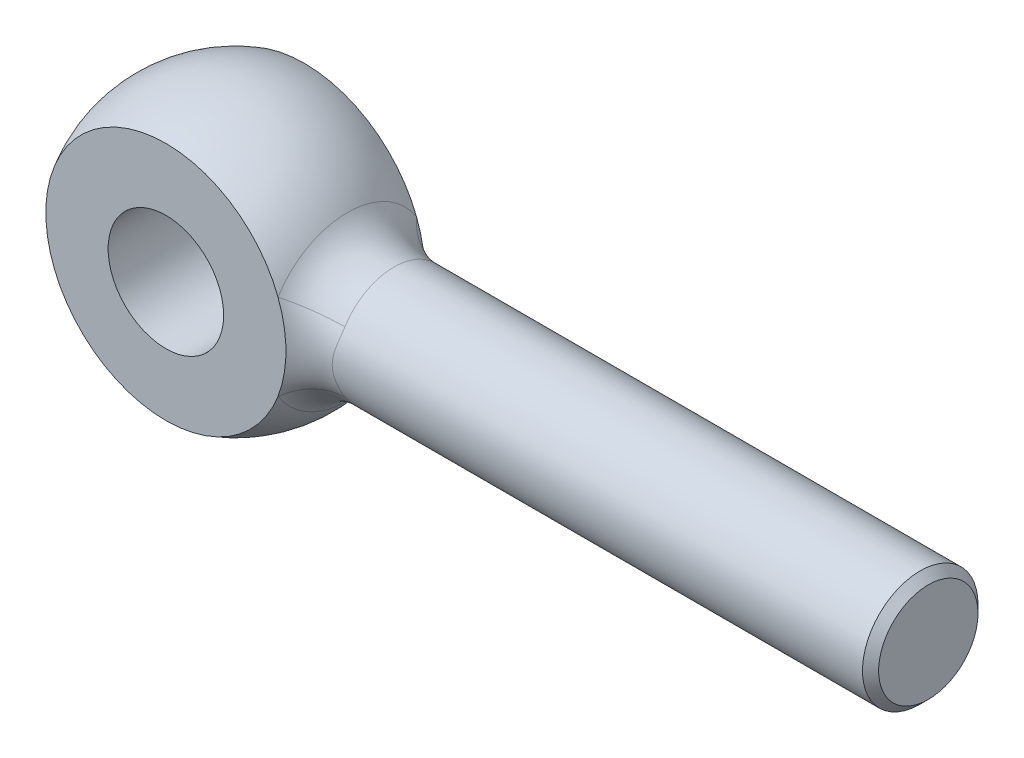
ISO-10303-21;
HEADER;
FILE_DESCRIPTION(('STEP AP214'),'2;1');
FILE_NAME('part.step','',(''),(''),'','','');
FILE_SCHEMA(('AUTOMOTIVE_DESIGN { 1 0 10303 214 1 1 1 1 }'));
ENDSEC;
DATA;
#1=APPLICATION_CONTEXT('core data for automotive mechanical design processes');
#2=APPLICATION_PROTOCOL_DEFINITION('international standard','automotive_design',2000,#1);
#3=PRODUCT_CONTEXT('',#1,'mechanical');
#4=PRODUCT('Part','Part','',(#3));
#5=PRODUCT_RELATED_PRODUCT_CATEGORY('part','',(#4));
#6=PRODUCT_DEFINITION_FORMATION('','',#4);
#7=PRODUCT_DEFINITION_CONTEXT('part definition',#1,'design');
#8=PRODUCT_DEFINITION('design','',#6,#7);
#9=PRODUCT_DEFINITION_SHAPE('','',#8);
#10=(LENGTH_UNIT() NAMED_UNIT(*) SI_UNIT(.MILLI.,.METRE.));
#11=(NAMED_UNIT(*) PLANE_ANGLE_UNIT() SI_UNIT($,.RADIAN.));
#12=(NAMED_UNIT(*) SI_UNIT($,.STERADIAN.) SOLID_ANGLE_UNIT());
#13=UNCERTAINTY_MEASURE_WITH_UNIT(LENGTH_MEASURE(1.E-05),#10,'distance_accuracy_value','');
#14=(GEOMETRIC_REPRESENTATION_CONTEXT(3) GLOBAL_UNCERTAINTY_ASSIGNED_CONTEXT((#13)) GLOBAL_UNIT_ASSIGNED_CONTEXT((#10,
#11,#12)) REPRESENTATION_CONTEXT('',''));
#15=CARTESIAN_POINT('',(0.,0.,0.));
#16=DIRECTION('',(0.,0.,1.));
#17=DIRECTION('',(1.,0.,0.));
#18=AXIS2_PLACEMENT_3D('',#15,#16,#17);
#19=CARTESIAN_POINT('',(0.,0.,0.));
#20=DIRECTION('',(0.,0.,-1.));
#21=DIRECTION('',(0.,1.,0.));
#22=AXIS2_PLACEMENT_3D('',#19,#20,#21);
#23=SPHERICAL_SURFACE('',#22,6.);
#24=CARTESIAN_POINT('',(0.,0.,3.));
#25=DIRECTION('',(0.,0.,-1.));
#26=DIRECTION('',(0.,1.,0.));
#27=AXIS2_PLACEMENT_3D('',#24,#25,#26);
#28=CIRCLE('',#27,5.19615242270663);
#29=CARTESIAN_POINT('',(4.85213897112971,-1.85923301520931,3.));
#30=VERTEX_POINT('',#29);
#31=CARTESIAN_POINT('',(4.85213897112971,1.85923301520931,3.));
#32=VERTEX_POINT('',#31);
#33=EDGE_CURVE('E99',#30,#32,#28,.T.);
#34=ORIENTED_EDGE('',*,*,#33,.T.);
#35=CARTESIAN_POINT('',(4.85213897112971,0.,0.));
#36=DIRECTION('',(-1.,0.,0.));
#37=DIRECTION('',(0.,0.,1.));
#38=AXIS2_PLACEMENT_3D('',#35,#36,#37);
#39=CIRCLE('',#38,3.52941176470588);
#40=CARTESIAN_POINT('',(4.85213897112971,1.85923301520931,-3.));
#41=VERTEX_POINT('',#40);
#42=EDGE_CURVE('E52',#32,#41,#39,.T.);
#43=ORIENTED_EDGE('',*,*,#42,.T.);
#44=CARTESIAN_POINT('',(0.,0.,-3.));
#45=DIRECTION('',(0.,0.,-1.));
#46=DIRECTION('',(0.,1.,0.));
#47=AXIS2_PLACEMENT_3D('',#44,#45,#46);
#48=CIRCLE('',#47,5.19615242270663);
#49=CARTESIAN_POINT('',(4.85213897112971,-1.85923301520931,-3.));
#50=VERTEX_POINT('',#49);
#51=EDGE_CURVE('E47',#50,#41,#48,.T.);
#52=ORIENTED_EDGE('',*,*,#51,.F.);
#53=CARTESIAN_POINT('',(4.85213897112971,0.,0.));
#54=DIRECTION('',(-1.,0.,0.));
#55=DIRECTION('',(0.,0.,1.));
#56=AXIS2_PLACEMENT_3D('',#53,#54,#55);
#57=CIRCLE('',#56,3.52941176470588);
#58=EDGE_CURVE('E193',#50,#30,#57,.T.);
#59=ORIENTED_EDGE('',*,*,#58,.T.);
#60=EDGE_LOOP('',(#34,#43,#52,#59));
#61=FACE_BOUND('',#60,.T.);
#62=ADVANCED_FACE('F31',(#61),#23,.T.);
#63=CARTESIAN_POINT('',(0.,5.19615242270663,3.));
#64=DIRECTION('',(0.,0.,1.));
#65=DIRECTION('',(0.,-1.,0.));
#66=AXIS2_PLACEMENT_3D('',#63,#64,#65);
#67=PLANE('',#66);
#68=CARTESIAN_POINT('',(0.,0.,3.));
#69=DIRECTION('',(0.,0.,1.));
#70=DIRECTION('',(1.,0.,0.));
#71=AXIS2_PLACEMENT_3D('',#68,#69,#70);
#72=CIRCLE('',#71,2.5);
#73=CARTESIAN_POINT('',(2.5,0.,3.));
#74=VERTEX_POINT('',#73);
#75=EDGE_CURVE('E90',#74,#74,#72,.T.);
#76=ORIENTED_EDGE('',*,*,#75,.F.);
#77=EDGE_LOOP('',(#76));
#78=FACE_BOUND('',#77,.T.);
#79=EDGE_CURVE('E96',#32,#30,#28,.T.);
#80=ORIENTED_EDGE('',*,*,#79,.F.);
#81=ORIENTED_EDGE('',*,*,#33,.F.);
#82=EDGE_LOOP('',(#80,#81));
#83=FACE_BOUND('',#82,.T.);
#84=ADVANCED_FACE('F152',(#78,#83),#67,.T.);
#85=CARTESIAN_POINT('',(0.,0.,-3.));
#86=DIRECTION('',(0.,0.,-1.));
#87=DIRECTION('',(0.,1.,0.));
#88=AXIS2_PLACEMENT_3D('',#85,#86,#87);
#89=PLANE('',#88);
#90=CARTESIAN_POINT('',(0.,0.,-3.));
#91=DIRECTION('',(0.,0.,1.));
#92=DIRECTION('',(1.,0.,0.));
#93=AXIS2_PLACEMENT_3D('',#90,#91,#92);
#94=CIRCLE('',#93,2.5);
#95=CARTESIAN_POINT('',(2.5,0.,-3.));
#96=VERTEX_POINT('',#95);
#97=EDGE_CURVE('E147',#96,#96,#94,.T.);
#98=ORIENTED_EDGE('',*,*,#97,.T.);
#99=EDGE_LOOP('',(#98));
#100=FACE_BOUND('',#99,.T.);
#101=EDGE_CURVE('E88',#41,#50,#48,.T.);
#102=ORIENTED_EDGE('',*,*,#101,.T.);
#103=ORIENTED_EDGE('',*,*,#51,.T.);
#104=EDGE_LOOP('',(#102,#103));
#105=FACE_BOUND('',#104,.T.);
#106=ADVANCED_FACE('F150',(#100,#105),#89,.T.);
#107=CARTESIAN_POINT('',(0.,0.,-3.));
#108=DIRECTION('',(0.,0.,1.));
#109=DIRECTION('',(1.,0.,0.));
#110=AXIS2_PLACEMENT_3D('',#107,#108,#109);
#111=CYLINDRICAL_SURFACE('',#110,2.5);
#112=CARTESIAN_POINT('',(2.5,0.,-3.));
#113=CARTESIAN_POINT('',(2.5,0.,-2.9375));
#114=CARTESIAN_POINT('',(2.5,0.,-2.875));
#115=CARTESIAN_POINT('',(2.5,0.,-2.75));
#116=CARTESIAN_POINT('',(2.5,0.,-2.6875));
#117=CARTESIAN_POINT('',(2.5,0.,-2.5625));
#118=CARTESIAN_POINT('',(2.5,0.,-2.5));
#119=CARTESIAN_POINT('',(2.5,0.,-2.375));
#120=CARTESIAN_POINT('',(2.5,0.,-2.3125));
#121=CARTESIAN_POINT('',(2.5,0.,-2.1875));
#122=CARTESIAN_POINT('',(2.5,0.,-2.125));
#123=CARTESIAN_POINT('',(2.5,0.,-2.));
#124=CARTESIAN_POINT('',(2.5,0.,-1.9375));
#125=CARTESIAN_POINT('',(2.5,0.,-1.8125));
#126=CARTESIAN_POINT('',(2.5,0.,-1.75));
#127=CARTESIAN_POINT('',(2.5,0.,-1.625));
#128=CARTESIAN_POINT('',(2.5,0.,-1.5625));
#129=CARTESIAN_POINT('',(2.5,0.,-1.4375));
#130=CARTESIAN_POINT('',(2.5,0.,-1.375));
#131=CARTESIAN_POINT('',(2.5,0.,-1.25));
#132=CARTESIAN_POINT('',(2.5,0.,-1.1875));
#133=CARTESIAN_POINT('',(2.5,0.,-1.0625));
#134=CARTESIAN_POINT('',(2.5,0.,-1.));
#135=CARTESIAN_POINT('',(2.5,0.,-0.875000000000003));
#136=CARTESIAN_POINT('',(2.5,0.,-0.812500000000003));
#137=CARTESIAN_POINT('',(2.5,0.,-0.687500000000003));
#138=CARTESIAN_POINT('',(2.5,0.,-0.625000000000003));
#139=CARTESIAN_POINT('',(2.5,0.,-0.500000000000003));
#140=CARTESIAN_POINT('',(2.5,0.,-0.437500000000003));
#141=CARTESIAN_POINT('',(2.5,0.,-0.312500000000003));
#142=CARTESIAN_POINT('',(2.5,0.,-0.250000000000003));
#143=CARTESIAN_POINT('',(2.5,0.,-0.125000000000003));
#144=CARTESIAN_POINT('',(2.5,0.,-0.0625000000000027));
#145=CARTESIAN_POINT('',(2.5,0.,0.0624999999999975));
#146=CARTESIAN_POINT('',(2.5,0.,0.124999999999998));
#147=CARTESIAN_POINT('',(2.5,0.,0.249999999999998));
#148=CARTESIAN_POINT('',(2.5,0.,0.312499999999998));
#149=CARTESIAN_POINT('',(2.5,0.,0.437499999999998));
#150=CARTESIAN_POINT('',(2.5,0.,0.499999999999998));
#151=CARTESIAN_POINT('',(2.5,0.,0.624999999999998));
#152=CARTESIAN_POINT('',(2.5,0.,0.687499999999998));
#153=CARTESIAN_POINT('',(2.5,0.,0.812499999999998));
#154=CARTESIAN_POINT('',(2.5,0.,0.874999999999997));
#155=CARTESIAN_POINT('',(2.5,0.,0.999999999999997));
#156=CARTESIAN_POINT('',(2.5,0.,1.0625));
#157=CARTESIAN_POINT('',(2.5,0.,1.1875));
#158=CARTESIAN_POINT('',(2.5,0.,1.25));
#159=CARTESIAN_POINT('',(2.5,0.,1.375));
#160=CARTESIAN_POINT('',(2.5,0.,1.4375));
#161=CARTESIAN_POINT('',(2.5,0.,1.5625));
#162=CARTESIAN_POINT('',(2.5,0.,1.625));
#163=CARTESIAN_POINT('',(2.5,0.,1.75));
#164=CARTESIAN_POINT('',(2.5,0.,1.8125));
#165=CARTESIAN_POINT('',(2.5,0.,1.9375));
#166=CARTESIAN_POINT('',(2.5,0.,2.));
#167=CARTESIAN_POINT('',(2.5,0.,2.125));
#168=CARTESIAN_POINT('',(2.5,0.,2.1875));
#169=CARTESIAN_POINT('',(2.5,0.,2.3125));
#170=CARTESIAN_POINT('',(2.5,0.,2.375));
#171=CARTESIAN_POINT('',(2.5,0.,2.5));
#172=CARTESIAN_POINT('',(2.5,0.,2.5625));
#173=CARTESIAN_POINT('',(2.5,0.,2.6875));
#174=CARTESIAN_POINT('',(2.5,0.,2.75));
#175=CARTESIAN_POINT('',(2.5,0.,2.875));
#176=CARTESIAN_POINT('',(2.5,0.,2.9375));
#177=CARTESIAN_POINT('',(2.5,0.,3.));
#178=B_SPLINE_CURVE_WITH_KNOTS('',3,(#112,#113,#114,#115,#116,#117,#118,#119,#120,#121,#122,
#123,#124,#125,#126,#127,#128,#129,#130,#131,#132,#133,#134,#135,#136,#137,#138,#139,#140,#141,
#142,#143,#144,#145,#146,#147,#148,#149,#150,#151,#152,#153,#154,#155,#156,#157,#158,#159,#160,
#161,#162,#163,#164,#165,#166,#167,#168,#169,#170,#171,#172,#173,#174,#175,#176,#177),
.UNSPECIFIED.,.F.,.F.,(4,2,2,2,2,2,2,2,2,2,2,2,2,2,2,2,2,2,2,2,2,2,2,2,2,2,2,2,2,2,2,2,4),(0.,
0.1875,0.375,0.5625,0.75,0.9375,1.125,1.3125,1.5,1.6875,1.875,2.0625,2.25,2.4375,2.625,2.8125,
3.,3.1875,3.375,3.5625,3.75,3.9375,4.125,4.3125,4.5,4.6875,4.875,5.0625,5.25,5.4375,5.625,
5.8125,6.),.UNSPECIFIED.);
#179=EDGE_CURVE('BSEAM116',#96,#74,#178,.T.);
#180=ORIENTED_EDGE('',*,*,#97,.F.);
#181=ORIENTED_EDGE('',*,*,#75,.T.);
#182=ORIENTED_EDGE('',*,*,#179,.T.);
#183=ORIENTED_EDGE('',*,*,#179,.F.);
#184=EDGE_LOOP('',(#180,#182,#181,#183));
#185=FACE_BOUND('',#184,.T.);
#186=ADVANCED_FACE('F116',(#185),#111,.F.);
#187=CARTESIAN_POINT('',(-500000.,0.,0.));
#188=DIRECTION('',(1.,0.,0.));
#189=DIRECTION('',(0.,0.,-1.));
#190=AXIS2_PLACEMENT_3D('',#187,#188,#189);
#191=CYLINDRICAL_SURFACE('',#190,2.5);
#192=CARTESIAN_POINT('',(29.6500000000037,0.,0.));
#193=DIRECTION('',(1.,0.,0.));
#194=DIRECTION('',(0.,0.,-1.));
#195=AXIS2_PLACEMENT_3D('',#192,#193,#194);
#196=CIRCLE('',#195,2.5);
#197=CARTESIAN_POINT('',(29.6500000000037,0.,-2.5));
#198=VERTEX_POINT('',#197);
#199=EDGE_CURVE('E11',#198,#198,#196,.F.);
#200=ORIENTED_EDGE('',*,*,#199,.T.);
#201=EDGE_LOOP('',(#200));
#202=FACE_BOUND('',#201,.T.);
#203=CARTESIAN_POINT('',(6.87386354240971,0.,0.));
#204=DIRECTION('',(-1.,0.,0.));
#205=DIRECTION('',(0.,0.,1.));
#206=AXIS2_PLACEMENT_3D('',#203,#204,#205);
#207=CIRCLE('',#206,2.5);
#208=CARTESIAN_POINT('',(6.87386354240971,1.31695671910659,-2.125));
#209=VERTEX_POINT('',#208);
#210=CARTESIAN_POINT('',(6.87386354240971,1.31695671910659,2.125));
#211=VERTEX_POINT('',#210);
#212=EDGE_CURVE('E76',#209,#211,#207,.F.);
#213=ORIENTED_EDGE('',*,*,#212,.T.);
#214=CARTESIAN_POINT('',(4.59214994265628,-2.43149314293953,3.));
#215=CARTESIAN_POINT('',(5.28053575775771,-1.57535220086278,1.96520839767909));
#216=CARTESIAN_POINT('',(6.75832715044316,-1.78923016469218,1.74603992444491));
#217=CARTESIAN_POINT('',(4.61490376458602,-2.38850683564425,3.));
#218=CARTESIAN_POINT('',(5.31133447792518,-1.55959961205067,1.97255373721356));
#219=CARTESIAN_POINT('',(6.77910060073798,-1.75423109346333,1.78191190260491));
#220=CARTESIAN_POINT('',(4.63745636511603,-2.3444677912677,3.));
#221=CARTESIAN_POINT('',(5.34142415476619,-1.54285102882922,1.98165998300467));
#222=CARTESIAN_POINT('',(6.79676173803568,-1.71794485728992,1.81692874609134));
#223=CARTESIAN_POINT('',(4.68208984782817,-2.25401656337519,3.));
#224=CARTESIAN_POINT('',(5.39964168622278,-1.50660421494995,2.00308043484603));
#225=CARTESIAN_POINT('',(6.82631837247987,-1.64302998661491,1.88494214654378));
#226=CARTESIAN_POINT('',(4.70417113781937,-2.20760656006237,3.));
#227=CARTESIAN_POINT('',(5.4277688669536,-1.4871353529735,2.01536574496717));
#228=CARTESIAN_POINT('',(6.83821906475119,-1.60440349821119,1.91794050035157));
#229=CARTESIAN_POINT('',(4.76925390986343,-2.06520099180171,3.));
#230=CARTESIAN_POINT('',(5.50800845739551,-1.42401012943105,2.05618321132367));
#231=CARTESIAN_POINT('',(6.86584024141128,-1.4860110400398,2.01293813667689));
#232=CARTESIAN_POINT('',(4.81152459527922,-1.96523133744892,3.));
#233=CARTESIAN_POINT('',(5.55713810549072,-1.37513487706764,2.08895338732615));
#234=CARTESIAN_POINT('',(6.87385227471106,-1.40306501907976,2.07162568455478));
#235=CARTESIAN_POINT('',(4.8783946126459,-1.79070915163239,3.));
#236=CARTESIAN_POINT('',(5.62890675658226,-1.27978016024519,2.14803422907822));
#237=CARTESIAN_POINT('',(6.87387082658577,-1.26129099463547,2.15950445471963));
#238=CARTESIAN_POINT('',(4.90395806114932,-1.71966583041613,3.));
#239=CARTESIAN_POINT('',(5.65470668144478,-1.23880448776534,2.17240659583395));
#240=CARTESIAN_POINT('',(6.87053448817763,-1.20430371320232,2.19178844145302));
#241=CARTESIAN_POINT('',(4.95325032102841,-1.57205756477042,3.));
#242=CARTESIAN_POINT('',(5.70135971194108,-1.14902529564279,2.22187165387093));
#243=CARTESIAN_POINT('',(6.85874012586845,-1.08807830259442,2.25174446555758));
#244=CARTESIAN_POINT('',(4.97697936627991,-1.49549332663971,3.));
#245=CARTESIAN_POINT('',(5.72226372809931,-1.10027824672045,2.24696521577949));
#246=CARTESIAN_POINT('',(6.8502827560878,-1.02884046179405,2.27941709137223));
#247=CARTESIAN_POINT('',(5.02208838637354,-1.33622773621118,3.));
#248=CARTESIAN_POINT('',(5.75919637874928,-0.994766582037669,2.2961562377678));
#249=CARTESIAN_POINT('',(6.82996392358939,-0.908272256559426,2.33009420794455));
#250=CARTESIAN_POINT('',(5.04345843771728,-1.25350273984687,3.));
#251=CARTESIAN_POINT('',(5.77525913675865,-0.937996614504071,2.32027606751086));
#252=CARTESIAN_POINT('',(6.81808878604984,-0.84693437601848,2.35307929929945));
#253=CARTESIAN_POINT('',(5.0829956710211,-1.08207581441005,3.));
#254=CARTESIAN_POINT('',(5.8027192817968,-0.817063699502059,2.36563031726336));
#255=CARTESIAN_POINT('',(6.7930115433918,-0.722706570778251,2.39415434758543));
#256=CARTESIAN_POINT('',(5.10116268053655,-0.993373563890664,3.));
#257=CARTESIAN_POINT('',(5.81416505850588,-0.752888667793522,2.3869099789471));
#258=CARTESIAN_POINT('',(6.77980936688855,-0.659816562723553,2.41224404098724));
#259=CARTESIAN_POINT('',(5.133769783665,-0.808336982222404,3.));
#260=CARTESIAN_POINT('',(5.83317177270153,-0.616670109113473,2.42535367081966));
#261=CARTESIAN_POINT('',(6.75412598731616,-0.531409319746842,2.4437813743836));
#262=CARTESIAN_POINT('',(5.14812236233714,-0.711880425797137,3.));
#263=CARTESIAN_POINT('',(5.84068604935766,-0.544415702972543,2.44248046219873));
#264=CARTESIAN_POINT('',(6.74166609915638,-0.465864656223572,2.45712206448678));
#265=CARTESIAN_POINT('',(5.17161456510394,-0.514100714128217,3.));
#266=CARTESIAN_POINT('',(5.85222557044449,-0.394834809688415,2.47053593334535));
#267=CARTESIAN_POINT('',(6.72032900847461,-0.333775500541907,2.47852132015821));
#268=CARTESIAN_POINT('',(5.18075512882778,-0.412778439656206,3.));
#269=CARTESIAN_POINT('',(5.85627741111682,-0.317388833417816,2.48151904357428));
#270=CARTESIAN_POINT('',(6.71145116026202,-0.267231190822656,2.48658083786253));
#271=CARTESIAN_POINT('',(5.19301777361388,-0.207573020256737,3.));
#272=CARTESIAN_POINT('',(5.86156507424017,-0.159990647980406,2.49622745732));
#273=CARTESIAN_POINT('',(6.69936859130023,-0.133752220883058,2.49731446053791));
#274=CARTESIAN_POINT('',(5.19615608527373,-0.103697552968933,3.));
#275=CARTESIAN_POINT('',(5.86282050140857,-0.0798807066107877,2.5000044561634));
#276=CARTESIAN_POINT('',(6.69614857322438,-0.0668191056656173,2.50000308972525));
#277=CARTESIAN_POINT('',(5.19614875416296,0.104050074106533,3.));
#278=CARTESIAN_POINT('',(5.86281767488507,0.0801523733243785,2.49999553665747));
#279=CARTESIAN_POINT('',(6.69615627823717,0.0670462482282195,2.49999690511617));
#280=CARTESIAN_POINT('',(5.19300322676458,0.207922233919905,3.));
#281=CARTESIAN_POINT('',(5.8615594607505,0.160259169274489,2.49620973684774));
#282=CARTESIAN_POINT('',(6.69938388294647,0.133978486898146,2.49730219015876));
#283=CARTESIAN_POINT('',(5.18099822303184,0.408608492862907,3.));
#284=CARTESIAN_POINT('',(5.85638185970961,0.31418229108765,2.4818115656295));
#285=CARTESIAN_POINT('',(6.71121073415326,0.26451962864652,2.48679318433977));
#286=CARTESIAN_POINT('',(5.1723800332294,0.505536932703433,3.));
#287=CARTESIAN_POINT('',(5.85256350616984,0.388277395405999,2.47145810155465));
#288=CARTESIAN_POINT('',(6.71958268776289,0.328151643768273,2.47919487031465));
#289=CARTESIAN_POINT('',(5.15034663440711,0.695010504169693,3.));
#290=CARTESIAN_POINT('',(5.84181425991675,0.531696848105887,2.44513655691866));
#291=CARTESIAN_POINT('',(6.7396898863661,0.454514395543326,2.45916861075663));
#292=CARTESIAN_POINT('',(5.1369308923803,0.787555147462384,3.));
#293=CARTESIAN_POINT('',(5.83486087213319,0.60112791287206,2.42912177748058));
#294=CARTESIAN_POINT('',(6.7514255050333,0.517245031247764,2.44674012857986));
#295=CARTESIAN_POINT('',(5.10611604160582,0.96743475766652,3.));
#296=CARTESIAN_POINT('',(5.81717454078441,0.73394910021624,2.39272981231407));
#297=CARTESIAN_POINT('',(6.77606712257304,0.641619764359883,2.4171094165628));
#298=CARTESIAN_POINT('',(5.08871022901508,1.05476064150526,3.));
#299=CARTESIAN_POINT('',(5.80640090434268,0.797388927566587,2.37229427704273));
#300=CARTESIAN_POINT('',(6.78897506881877,0.703261842965872,2.39989914224598));
#301=CARTESIAN_POINT('',(5.05074703659571,1.22370514902623,3.));
#302=CARTESIAN_POINT('',(5.78053270257552,0.917245605894557,2.32857079049401));
#303=CARTESIAN_POINT('',(6.81375724791258,0.825092162079843,2.36078715652006));
#304=CARTESIAN_POINT('',(5.03018974389835,1.30532393040607,3.));
#305=CARTESIAN_POINT('',(5.76539366645214,0.973678293362055,2.30523897942312));
#306=CARTESIAN_POINT('',(6.82563150932547,0.885280442728796,2.33888557480828));
#307=CARTESIAN_POINT('',(4.98479784236225,1.4695764279093,3.));
#308=CARTESIAN_POINT('',(5.7289816728793,1.08358216256709,2.25530458502804));
#309=CARTESIAN_POINT('',(6.8472592247355,1.00892487377986,2.28842628515865));
#310=CARTESIAN_POINT('',(4.95974869047,1.55171480623705,3.));
#311=CARTESIAN_POINT('',(5.70725082348089,1.13633445812298,2.22857701334387));
#312=CARTESIAN_POINT('',(6.85674922779622,1.07222830649481,2.25946290619329));
#313=CARTESIAN_POINT('',(4.9075366632047,1.70967749662367,3.));
#314=CARTESIAN_POINT('',(5.65828641889,1.23304453288595,2.175819043809));
#315=CARTESIAN_POINT('',(6.87003809483746,1.19630031720458,2.19629492865154));
#316=CARTESIAN_POINT('',(4.88037464978229,1.7855043576292,3.));
#317=CARTESIAN_POINT('',(5.63099357756278,1.27694101464195,2.14978488345376));
#318=CARTESIAN_POINT('',(6.87383926692379,1.25706991350832,2.16209246192086));
#319=CARTESIAN_POINT('',(4.82434415025922,1.93181099590173,3.));
#320=CARTESIAN_POINT('',(5.57103910119506,1.35673203653411,2.10036423278424));
#321=CARTESIAN_POINT('',(6.87388766513498,1.37590882134256,2.08848667559372));
#322=CARTESIAN_POINT('',(4.79546636364266,2.00225578165343,3.));
#323=CARTESIAN_POINT('',(5.53829925215443,1.39248889737653,2.0770261697273));
#324=CARTESIAN_POINT('',(6.87008921310799,1.43395964519697,2.04905324501219));
#325=CARTESIAN_POINT('',(4.73649100392029,2.13800852417529,3.));
#326=CARTESIAN_POINT('',(5.46815489089738,1.45699822287206,2.03481463104619));
#327=CARTESIAN_POINT('',(6.85326158629086,1.54645124864898,1.96556393134342));
#328=CARTESIAN_POINT('',(4.70639108455953,2.20330581652231,3.));
#329=CARTESIAN_POINT('',(5.4307156037342,1.48565020344881,2.01600551450621));
#330=CARTESIAN_POINT('',(6.8402137799444,1.60088449867127,1.92149887132414));
#331=CARTESIAN_POINT('',(4.67590808800945,2.26624878433234,3.));
#332=CARTESIAN_POINT('',(5.39155050442724,1.51128592173718,2.00044213210106));
#333=CARTESIAN_POINT('',(6.82175156100176,1.65313195759463,1.8754078838427));
#334=(BOUNDED_SURFACE() B_SPLINE_SURFACE(3,2,((#214,#215,#216),(#217,#218,#219),(#220,#221,
#222),(#223,#224,#225),(#226,#227,#228),(#229,#230,#231),(#232,#233,#234),(#235,#236,#237),
(#238,#239,#240),(#241,#242,#243),(#244,#245,#246),(#247,#248,#249),(#250,#251,#252),(#253,#254,
#255),(#256,#257,#258),(#259,#260,#261),(#262,#263,#264),(#265,#266,#267),(#268,#269,#270),
(#271,#272,#273),(#274,#275,#276),(#277,#278,#279),(#280,#281,#282),(#283,#284,#285),(#286,#287,
#288),(#289,#290,#291),(#292,#293,#294),(#295,#296,#297),(#298,#299,#300),(#301,#302,#303),
(#304,#305,#306),(#307,#308,#309),(#310,#311,#312),(#313,#314,#315),(#316,#317,#318),(#319,#320,
#321),(#322,#323,#324),(#325,#326,#327),(#328,#329,#330),(#331,#332,#333)),.UNSPECIFIED.,.F.,
.F.,.F.) B_SPLINE_SURFACE_WITH_KNOTS((4,2,2,2,2,2,2,2,2,2,2,2,2,2,2,2,2,2,2,4),(3,3),(0.,
0.306874845816542,0.613472414905768,1.22088780228112,1.61355863196533,2.00617931553497,
2.4003932871802,2.79462847594899,3.19725118928502,3.59980129428171,4.00126132214201,
4.40271397920349,4.78759099989169,5.17251079361862,5.55808210564121,5.94364275941515,
6.36173259498714,6.77965275467295,7.2000924034159,7.62138138566917),(0.,1.),
.UNSPECIFIED.) GEOMETRIC_REPRESENTATION_ITEM() RATIONAL_B_SPLINE_SURFACE(((1.,0.856101832731396,
1.),(1.,0.858642244405248,1.),(1.,0.861316738759473,1.),(1.,0.866881962600633,1.),(1.,
0.869772494524879,1.),(1.,0.87864161799571,1.),(1.,0.884867476557533,1.),(1.,0.895183073476045,
1.),(1.,0.899249846421728,1.),(1.,0.907247649770585,1.),(1.,0.911178697442465,1.),(1.,
0.918740850713103,1.),(1.,0.922370674384753,1.),(1.,0.929127710867441,1.),(1.,0.932254896616775,
1.),(1.,0.937881051025087,1.),(1.,0.940365238590998,1.),(1.,0.944432807754107,1.),(1.,
0.946016351720428,1.),(1.,0.948140508697703,1.),(1.,0.948683934279783,1.),(1.,0.948682660786239,
1.),(1.,0.94813798168838,1.),(1.,0.946058468186153,1.),(1.,0.944565445011657,1.),(1.,
0.940750261329809,1.),(1.,0.938428008695299,1.),(1.,0.933108402694527,1.),(1.,0.930109913300485,
1.),(1.,0.923612393628672,1.),(1.,0.920113377189517,1.),(1.,0.912478934938097,1.),(1.,
0.908314722372954,1.),(1.,0.899820033646503,1.),(1.,0.895489625646799,1.),(1.,0.886843969906887,
1.),(1.,0.88252897094876,1.),(1.,0.874118019577032,1.),(1.,0.870022527269921,1.),(1.,
0.86613477284922,1.))) REPRESENTATION_ITEM('') SURFACE());
#335=CARTESIAN_POINT('',(6.82175156100176,1.65313195759463,1.8754078838427));
#336=CARTESIAN_POINT('',(6.8402137799444,1.60088449867127,1.92149887132414));
#337=CARTESIAN_POINT('',(6.85326158629086,1.54645124864898,1.96556393134342));
#338=CARTESIAN_POINT('',(6.87008921310799,1.43395964519697,2.04905324501219));
#339=CARTESIAN_POINT('',(6.87388766513498,1.37590882134256,2.08848667559372));
#340=CARTESIAN_POINT('',(6.87383926692379,1.25706991350832,2.16209246192086));
#341=CARTESIAN_POINT('',(6.87003809483746,1.19630031720458,2.19629492865154));
#342=CARTESIAN_POINT('',(6.85674922779622,1.07222830649481,2.25946290619329));
#343=CARTESIAN_POINT('',(6.8472592247355,1.00892487377986,2.28842628515865));
#344=CARTESIAN_POINT('',(6.82563150932547,0.885280442728796,2.33888557480828));
#345=CARTESIAN_POINT('',(6.81375724791258,0.825092162079843,2.36078715652006));
#346=CARTESIAN_POINT('',(6.78897506881877,0.703261842965872,2.39989914224598));
#347=CARTESIAN_POINT('',(6.77606712257304,0.641619764359883,2.4171094165628));
#348=CARTESIAN_POINT('',(6.7514255050333,0.517245031247764,2.44674012857986));
#349=CARTESIAN_POINT('',(6.7396898863661,0.454514395543326,2.45916861075663));
#350=CARTESIAN_POINT('',(6.71958268776289,0.328151643768273,2.47919487031465));
#351=CARTESIAN_POINT('',(6.71121073415326,0.26451962864652,2.48679318433977));
#352=CARTESIAN_POINT('',(6.69938388294647,0.133978486898146,2.49730219015876));
#353=CARTESIAN_POINT('',(6.69615627823717,0.0670462482282195,2.49999690511617));
#354=CARTESIAN_POINT('',(6.69614857322438,-0.0668191056656173,2.50000308972525));
#355=CARTESIAN_POINT('',(6.69936859130023,-0.133752220883058,2.49731446053791));
#356=CARTESIAN_POINT('',(6.71145116026202,-0.267231190822656,2.48658083786253));
#357=CARTESIAN_POINT('',(6.72032900847461,-0.333775500541907,2.47852132015821));
#358=CARTESIAN_POINT('',(6.74166609915638,-0.465864656223572,2.45712206448678));
#359=CARTESIAN_POINT('',(6.75412598731616,-0.531409319746842,2.4437813743836));
#360=CARTESIAN_POINT('',(6.77980936688854,-0.659816562723553,2.41224404098724));
#361=CARTESIAN_POINT('',(6.7930115433918,-0.722706570778251,2.39415434758543));
#362=CARTESIAN_POINT('',(6.81808878604984,-0.84693437601848,2.35307929929945));
#363=CARTESIAN_POINT('',(6.82996392358939,-0.908272256559426,2.33009420794455));
#364=CARTESIAN_POINT('',(6.8502827560878,-1.02884046179405,2.27941709137223));
#365=CARTESIAN_POINT('',(6.85874012586845,-1.08807830259442,2.25174446555758));
#366=CARTESIAN_POINT('',(6.87053448817763,-1.20430371320232,2.19178844145302));
#367=CARTESIAN_POINT('',(6.87387082658577,-1.26129099463547,2.15950445471963));
#368=CARTESIAN_POINT('',(6.87385227471106,-1.40306501907976,2.07162568455478));
#369=CARTESIAN_POINT('',(6.86584024141128,-1.4860110400398,2.01293813667689));
#370=CARTESIAN_POINT('',(6.83821906475119,-1.60440349821119,1.91794050035157));
#371=CARTESIAN_POINT('',(6.82631837247987,-1.64302998661491,1.88494214654378));
#372=CARTESIAN_POINT('',(6.79676173803568,-1.71794485728992,1.81692874609134));
#373=CARTESIAN_POINT('',(6.77910060073798,-1.75423109346333,1.78191190260491));
#374=CARTESIAN_POINT('',(6.75832715044316,-1.78923016469218,1.74603992444491));
#375=B_SPLINE_CURVE_WITH_KNOTS('',3,(#335,#336,#337,#338,#339,#340,#341,#342,#343,#344,#345,
#346,#347,#348,#349,#350,#351,#352,#353,#354,#355,#356,#357,#358,#359,#360,#361,#362,#363,#364,
#365,#366,#367,#368,#369,#370,#371,#372,#373,#374),.UNSPECIFIED.,.F.,.F.,(4,2,2,2,2,2,2,2,2,2,2,
2,2,2,2,2,2,2,2,4),(0.,0.421288982253265,0.841728630996219,1.25964879068203,1.67773862625402,
2.06329928002796,2.44887059205055,2.83379038577747,3.21866740646568,3.62012006352716,
4.02158009138746,4.42413019638415,4.82675290972018,5.22098809848897,5.6152020701342,
6.00782275370384,6.40049358338804,7.0079089707634,7.31450653985263,7.62138138566917),.UNSPECIFIED.);
#376=CARTESIAN_POINT('',(6.87386354240971,-1.31695671910659,2.125));
#377=VERTEX_POINT('',#376);
#378=EDGE_CURVE('E195',#211,#377,#375,.T.);
#379=ORIENTED_EDGE('',*,*,#378,.T.);
#380=CARTESIAN_POINT('',(6.87386354240971,0.,0.));
#381=DIRECTION('',(-1.,0.,0.));
#382=DIRECTION('',(0.,0.,1.));
#383=AXIS2_PLACEMENT_3D('',#380,#381,#382);
#384=CIRCLE('',#383,2.5);
#385=CARTESIAN_POINT('',(6.87386354240971,-1.31695671910659,-2.125));
#386=VERTEX_POINT('',#385);
#387=EDGE_CURVE('E79',#377,#386,#384,.F.);
#388=ORIENTED_EDGE('',*,*,#387,.T.);
#389=CARTESIAN_POINT('',(4.59214993504575,2.43149315731286,-3.));
#390=CARTESIAN_POINT('',(5.28053574841737,1.57535220504545,-1.96520839339296));
#391=CARTESIAN_POINT('',(6.75832715044316,1.78923016469218,-1.74603992444491));
#392=CARTESIAN_POINT('',(4.6149037617876,2.38850684092901,-3.));
#393=CARTESIAN_POINT('',(5.31133447451684,1.55959961357558,-1.97255373564611));
#394=CARTESIAN_POINT('',(6.77910060073832,1.75423109346314,-1.78191190260511));
#395=CARTESIAN_POINT('',(4.63745636435152,2.34446779271128,-3.));
#396=CARTESIAN_POINT('',(5.34142415384232,1.54285102924197,-1.98165998257909));
#397=CARTESIAN_POINT('',(6.79676173803613,1.7179448572895,-1.81692874609175));
#398=CARTESIAN_POINT('',(4.68208984859292,2.25401656193101,-3.));
#399=CARTESIAN_POINT('',(5.39964168713326,1.50660421454454,-2.00308043526599));
#400=CARTESIAN_POINT('',(6.82631837248033,1.64302998661407,-1.88494214654451));
#401=CARTESIAN_POINT('',(4.70417113808175,2.20760655956728,-3.));
#402=CARTESIAN_POINT('',(5.42776886726366,1.48713535283616,-2.01536574511));
#403=CARTESIAN_POINT('',(6.83821906475155,1.60440349821016,-1.91794050035244));
#404=CARTESIAN_POINT('',(4.7692539093388,2.06520099279311,-3.));
#405=CARTESIAN_POINT('',(5.50800845678957,1.42401012969826,-2.05618321104412));
#406=CARTESIAN_POINT('',(6.86584024141125,1.48601104003893,-2.01293813667751));
#407=CARTESIAN_POINT('',(4.81152459516765,1.96523133765937,-3.));
#408=CARTESIAN_POINT('',(5.55713810536371,1.37513487712268,-2.08895338726792));
#409=CARTESIAN_POINT('',(6.87385227471103,1.40306501907931,-2.07162568455506));
#410=CARTESIAN_POINT('',(4.87839461271883,1.79070915149425,-3.));
#411=CARTESIAN_POINT('',(5.62890675666336,1.27978016021025,-2.14803422911528));
#412=CARTESIAN_POINT('',(6.87387082658579,1.26129099463546,-2.15950445471963));
#413=CARTESIAN_POINT('',(4.90395806116894,1.71966583037885,-3.));
#414=CARTESIAN_POINT('',(5.6547066814664,1.23880448775603,-2.17240659584381));
#415=CARTESIAN_POINT('',(6.87053448817763,1.20430371320232,-2.19178844145302));
#416=CARTESIAN_POINT('',(4.95325032100886,1.57205756480747,-3.));
#417=CARTESIAN_POINT('',(5.70135971191988,1.1490252956516,-2.22187165386138));
#418=CARTESIAN_POINT('',(6.85874012586845,1.08807830259441,-2.25174446555758));
#419=CARTESIAN_POINT('',(4.9769793662745,1.49549332665024,-3.));
#420=CARTESIAN_POINT('',(5.7222637280935,1.10027824672307,-2.24696521577684));
#421=CARTESIAN_POINT('',(6.8502827560878,1.02884046179404,-2.27941709137223));
#422=CARTESIAN_POINT('',(5.02208838637865,1.33622773620175,-3.));
#423=CARTESIAN_POINT('',(5.75919637875471,0.994766582035742,-2.29615623777015));
#424=CARTESIAN_POINT('',(6.8299639235894,0.908272256559421,-2.33009420794455));
#425=CARTESIAN_POINT('',(5.0434584377187,1.25350273984413,-3.));
#426=CARTESIAN_POINT('',(5.77525913676014,0.937996614503455,-2.32027606751152));
#427=CARTESIAN_POINT('',(6.81808878604984,0.846934376018475,-2.35307929929946));
#428=CARTESIAN_POINT('',(5.08299567101976,1.08207581441243,-3.));
#429=CARTESIAN_POINT('',(5.8027192817954,0.817063699502445,-2.36563031726278));
#430=CARTESIAN_POINT('',(6.7930115433918,0.722706570778246,-2.39415434758544));
#431=CARTESIAN_POINT('',(5.10116268053615,0.993373563891462,-3.));
#432=CARTESIAN_POINT('',(5.81416505850547,0.752888667793703,-2.38690997894692));
#433=CARTESIAN_POINT('',(6.77980936688855,0.659816562723549,-2.41224404098724));
#434=CARTESIAN_POINT('',(5.13376978366527,0.808336982222337,-3.));
#435=CARTESIAN_POINT('',(5.83317177270183,0.616670109113698,-2.42535367081975));
#436=CARTESIAN_POINT('',(6.75412598731616,0.531409319746836,-2.4437813743836));
#437=CARTESIAN_POINT('',(5.14812236233711,0.711880425797828,-3.));
#438=CARTESIAN_POINT('',(5.84068604935766,0.544415702972995,-2.44248046219868));
#439=CARTESIAN_POINT('',(6.74166609915638,0.465864656223566,-2.45712206448678));
#440=CARTESIAN_POINT('',(5.17161456510376,0.514100714129193,-3.));
#441=CARTESIAN_POINT('',(5.85222557044433,0.394834809688874,-2.47053593334525));
#442=CARTESIAN_POINT('',(6.72032900847461,0.3337755005419,-2.47852132015821));
#443=CARTESIAN_POINT('',(5.18075512882773,0.412778439656705,-3.));
#444=CARTESIAN_POINT('',(5.85627741111678,0.317388833418068,-2.48151904357426));
#445=CARTESIAN_POINT('',(6.71145116026202,0.267231190822649,-2.48658083786253));
#446=CARTESIAN_POINT('',(5.19301777361391,0.207573020256339,-3.));
#447=CARTESIAN_POINT('',(5.8615650742402,0.159990647980206,-2.49622745732002));
#448=CARTESIAN_POINT('',(6.69936859130023,0.133752220883051,-2.49731446053791));
#449=CARTESIAN_POINT('',(5.1961560852737,0.103697552968114,-3.));
#450=CARTESIAN_POINT('',(5.86282050140856,0.0798807066103399,-2.50000445616338));
#451=CARTESIAN_POINT('',(6.69614857322438,0.06681910566561,-2.50000308972525));
#452=CARTESIAN_POINT('',(5.19614875416298,-0.104050074106221,-3.));
#453=CARTESIAN_POINT('',(5.86281767488509,-0.0801523733242168,-2.49999553665749));
#454=CARTESIAN_POINT('',(6.69615627823717,-0.0670462482282263,-2.49999690511617));
#455=CARTESIAN_POINT('',(5.19300322676471,-0.207922233918041,-3.));
#456=CARTESIAN_POINT('',(5.8615594607506,-0.160259169273465,-2.49620973684784));
#457=CARTESIAN_POINT('',(6.69938388294648,-0.133978486898153,-2.49730219015876));
#458=CARTESIAN_POINT('',(5.18099822303191,-0.408608492861331,-3.));
#459=CARTESIAN_POINT('',(5.85638185970967,-0.314182291086771,-2.48181156562956));
#460=CARTESIAN_POINT('',(6.71121073415326,-0.264519628646526,-2.48679318433977));
#461=CARTESIAN_POINT('',(5.17238003322934,-0.505536932703561,-3.));
#462=CARTESIAN_POINT('',(5.8525635061698,-0.388277395406062,-2.47145810155461));
#463=CARTESIAN_POINT('',(6.7195826877629,-0.328151643768279,-2.47919487031465));
#464=CARTESIAN_POINT('',(5.1503466344071,-0.695010504170121,-3.));
#465=CARTESIAN_POINT('',(5.84181425991675,-0.531696848106134,-2.44513655691865));
#466=CARTESIAN_POINT('',(6.7396898863661,-0.454514395543332,-2.45916861075663));
#467=CARTESIAN_POINT('',(5.13693089238048,-0.787555147461409,-3.));
#468=CARTESIAN_POINT('',(5.83486087213335,-0.601127912871536,-2.42912177748072));
#469=CARTESIAN_POINT('',(6.7514255050333,-0.51724503124777,-2.44674012857985));
#470=CARTESIAN_POINT('',(5.10611604160605,-0.967434757665071,-3.));
#471=CARTESIAN_POINT('',(5.81717454078461,-0.733949100215445,-2.39272981231424));
#472=CARTESIAN_POINT('',(6.77606712257305,-0.64161976435989,-2.41710941656279));
#473=CARTESIAN_POINT('',(5.08871022901517,-1.05476064150474,-3.));
#474=CARTESIAN_POINT('',(5.80640090434276,-0.797388927566309,-2.3722942770428));
#475=CARTESIAN_POINT('',(6.78897506881878,-0.703261842965879,-2.39989914224598));
#476=CARTESIAN_POINT('',(5.05074703659571,-1.22370514902635,-3.));
#477=CARTESIAN_POINT('',(5.78053270257552,-0.917245605894629,-2.32857079049401));
#478=CARTESIAN_POINT('',(6.81375724791258,-0.82509216207985,-2.36078715652005));
#479=CARTESIAN_POINT('',(5.03018974389838,-1.3053239304059,-3.));
#480=CARTESIAN_POINT('',(5.76539366645217,-0.973678293361954,-2.30523897942315));
#481=CARTESIAN_POINT('',(6.82563150932547,-0.885280442728802,-2.33888557480828));
#482=CARTESIAN_POINT('',(4.98479784236249,-1.46957642790847,-3.));
#483=CARTESIAN_POINT('',(5.72898167287953,-1.08358216256667,-2.25530458502823));
#484=CARTESIAN_POINT('',(6.8472592247355,-1.00892487377987,-2.28842628515865));
#485=CARTESIAN_POINT('',(4.95974869047041,-1.55171480623584,-3.));
#486=CARTESIAN_POINT('',(5.7072508234813,-1.13633445812241,-2.22857701334418));
#487=CARTESIAN_POINT('',(6.85674922779622,-1.07222830649482,-2.25946290619328));
#488=CARTESIAN_POINT('',(4.90753666320477,-1.70967749662341,-3.));
#489=CARTESIAN_POINT('',(5.65828641889006,-1.23304453288581,-2.17581904380906));
#490=CARTESIAN_POINT('',(6.87003809483746,-1.19630031720459,-2.19629492865154));
#491=CARTESIAN_POINT('',(4.88037464978185,-1.78550435763027,-3.));
#492=CARTESIAN_POINT('',(5.63099357756231,-1.2769410146424,-2.14978488345346));
#493=CARTESIAN_POINT('',(6.87383926692379,-1.25706991350833,-2.16209246192086));
#494=CARTESIAN_POINT('',(4.82434415025903,-1.93181099590228,-3.));
#495=CARTESIAN_POINT('',(5.57103910119486,-1.3567320365344,-2.10036423278409));
#496=CARTESIAN_POINT('',(6.87388766513498,-1.37590882134256,-2.08848667559371));
#497=CARTESIAN_POINT('',(4.79546636364324,-2.00225578165213,-3.));
#498=CARTESIAN_POINT('',(5.53829925215508,-1.39248889737602,-2.0770261697277));
#499=CARTESIAN_POINT('',(6.87008921310799,-1.43395964519697,-2.04905324501218));
#500=CARTESIAN_POINT('',(4.73649100392186,-2.13800852417164,-3.));
#501=CARTESIAN_POINT('',(5.46815489089916,-1.45699822287053,-2.03481463104729));
#502=CARTESIAN_POINT('',(6.85326158629086,-1.54645124864898,-1.96556393134342));
#503=CARTESIAN_POINT('',(4.70639108456131,-2.20330581651818,-3.));
#504=CARTESIAN_POINT('',(5.43071560373625,-1.48565020344708,-2.01600551450747));
#505=CARTESIAN_POINT('',(6.8402137799444,-1.60088449867127,-1.92149887132414));
#506=CARTESIAN_POINT('',(4.67590808801024,-2.26624878433071,-3.));
#507=CARTESIAN_POINT('',(5.39155050442818,-1.5112859217366,-2.00044213210157));
#508=CARTESIAN_POINT('',(6.82175156100176,-1.65313195759463,-1.8754078838427));
#509=(BOUNDED_SURFACE() B_SPLINE_SURFACE(3,2,((#389,#390,#391),(#392,#393,#394),(#395,#396,
#397),(#398,#399,#400),(#401,#402,#403),(#404,#405,#406),(#407,#408,#409),(#410,#411,#412),
(#413,#414,#415),(#416,#417,#418),(#419,#420,#421),(#422,#423,#424),(#425,#426,#427),(#428,#429,
#430),(#431,#432,#433),(#434,#435,#436),(#437,#438,#439),(#440,#441,#442),(#443,#444,#445),
(#446,#447,#448),(#449,#450,#451),(#452,#453,#454),(#455,#456,#457),(#458,#459,#460),(#461,#462,
#463),(#464,#465,#466),(#467,#468,#469),(#470,#471,#472),(#473,#474,#475),(#476,#477,#478),
(#479,#480,#481),(#482,#483,#484),(#485,#486,#487),(#488,#489,#490),(#491,#492,#493),(#494,#495,
#496),(#497,#498,#499),(#500,#501,#502),(#503,#504,#505),(#506,#507,#508)),.UNSPECIFIED.,.F.,
.F.,.F.) B_SPLINE_SURFACE_WITH_KNOTS((4,2,2,2,2,2,2,2,2,2,2,2,2,2,2,2,2,2,2,4),(3,3),(0.,
0.30687484581836,0.613472414908934,1.22088780228114,1.61355863196535,2.00617931553499,
2.40039328718022,2.79462847594901,3.19725118928504,3.59980129428173,4.00126132214203,
4.40271397920351,4.78759099989172,5.17251079361864,5.55808210564123,5.94364275941517,
6.36173259498717,6.77965275467298,7.20009240341593,7.62138138566919),(0.,1.),
.UNSPECIFIED.) GEOMETRIC_REPRESENTATION_ITEM() RATIONAL_B_SPLINE_SURFACE(((1.,0.8561018315298,
1.),(1.,0.858642243963398,1.),(1.,0.861316738638745,1.),(1.,0.866881962721355,1.),(1.,
0.869772494566288,1.),(1.,0.878641617912882,1.),(1.,0.884867476539917,1.),(1.,0.895183073487557,
1.),(1.,0.899249846424825,1.),(1.,0.907247649767499,1.),(1.,0.911178697441613,1.),(1.,
0.91874085071391,1.),(1.,0.922370674384977,1.),(1.,0.92912771086723,1.),(1.,0.932254896616713,
1.),(1.,0.937881051025131,1.),(1.,0.940365238590997,1.),(1.,0.94443280775408,1.),(1.,
0.946016351720422,1.),(1.,0.948140508697708,1.),(1.,0.948683934279779,1.),(1.,0.948682660786242,
1.),(1.,0.948137981688398,1.),(1.,0.946058468186164,1.),(1.,0.944565445011648,1.),(1.,
0.940750261329807,1.),(1.,0.938428008695325,1.),(1.,0.93310840269456,1.),(1.,0.930109913300498,
1.),(1.,0.923612393628671,1.),(1.,0.920113377189521,1.),(1.,0.912478934938133,1.),(1.,
0.908314722373016,1.),(1.,0.899820033646513,1.),(1.,0.89548962564673,1.),(1.,0.886843969906859,
1.),(1.,0.88252897094885,1.),(1.,0.874118019577276,1.),(1.,0.870022527270198,1.),(1.,
0.866134772849344,1.))) REPRESENTATION_ITEM('') SURFACE());
#510=CARTESIAN_POINT('',(6.82175156100176,-1.65313195759463,-1.8754078838427));
#511=CARTESIAN_POINT('',(6.8402137799444,-1.60088449867127,-1.92149887132414));
#512=CARTESIAN_POINT('',(6.85326158629086,-1.54645124864898,-1.96556393134342));
#513=CARTESIAN_POINT('',(6.87008921310799,-1.43395964519697,-2.04905324501218));
#514=CARTESIAN_POINT('',(6.87388766513498,-1.37590882134256,-2.08848667559371));
#515=CARTESIAN_POINT('',(6.87383926692379,-1.25706991350833,-2.16209246192086));
#516=CARTESIAN_POINT('',(6.87003809483746,-1.19630031720459,-2.19629492865154));
#517=CARTESIAN_POINT('',(6.85674922779622,-1.07222830649482,-2.25946290619328));
#518=CARTESIAN_POINT('',(6.8472592247355,-1.00892487377987,-2.28842628515865));
#519=CARTESIAN_POINT('',(6.82563150932547,-0.885280442728803,-2.33888557480828));
#520=CARTESIAN_POINT('',(6.81375724791258,-0.82509216207985,-2.36078715652005));
#521=CARTESIAN_POINT('',(6.78897506881878,-0.703261842965879,-2.39989914224598));
#522=CARTESIAN_POINT('',(6.77606712257305,-0.641619764359889,-2.41710941656279));
#523=CARTESIAN_POINT('',(6.7514255050333,-0.51724503124777,-2.44674012857985));
#524=CARTESIAN_POINT('',(6.7396898863661,-0.454514395543332,-2.45916861075663));
#525=CARTESIAN_POINT('',(6.7195826877629,-0.328151643768279,-2.47919487031465));
#526=CARTESIAN_POINT('',(6.71121073415326,-0.264519628646526,-2.48679318433977));
#527=CARTESIAN_POINT('',(6.69938388294648,-0.133978486898153,-2.49730219015876));
#528=CARTESIAN_POINT('',(6.69615627823717,-0.0670462482282263,-2.49999690511617));
#529=CARTESIAN_POINT('',(6.69614857322438,0.06681910566561,-2.50000308972525));
#530=CARTESIAN_POINT('',(6.69936859130023,0.133752220883051,-2.49731446053791));
#531=CARTESIAN_POINT('',(6.71145116026202,0.267231190822649,-2.48658083786253));
#532=CARTESIAN_POINT('',(6.72032900847461,0.3337755005419,-2.47852132015821));
#533=CARTESIAN_POINT('',(6.74166609915638,0.465864656223566,-2.45712206448678));
#534=CARTESIAN_POINT('',(6.75412598731616,0.531409319746836,-2.4437813743836));
#535=CARTESIAN_POINT('',(6.77980936688854,0.659816562723549,-2.41224404098724));
#536=CARTESIAN_POINT('',(6.7930115433918,0.722706570778246,-2.39415434758543));
#537=CARTESIAN_POINT('',(6.81808878604984,0.846934376018475,-2.35307929929946));
#538=CARTESIAN_POINT('',(6.8299639235894,0.908272256559421,-2.33009420794455));
#539=CARTESIAN_POINT('',(6.8502827560878,1.02884046179404,-2.27941709137224));
#540=CARTESIAN_POINT('',(6.85874012586845,1.08807830259441,-2.25174446555758));
#541=CARTESIAN_POINT('',(6.87053448817763,1.20430371320232,-2.19178844145302));
#542=CARTESIAN_POINT('',(6.87387082658579,1.26129099463546,-2.15950445471963));
#543=CARTESIAN_POINT('',(6.87385227471103,1.40306501907931,-2.07162568455506));
#544=CARTESIAN_POINT('',(6.86584024141125,1.48601104003893,-2.01293813667751));
#545=CARTESIAN_POINT('',(6.83821906475155,1.60440349821016,-1.91794050035244));
#546=CARTESIAN_POINT('',(6.82631837248033,1.64302998661407,-1.88494214654451));
#547=CARTESIAN_POINT('',(6.79676173803613,1.7179448572895,-1.81692874609175));
#548=CARTESIAN_POINT('',(6.77910060073832,1.75423109346314,-1.78191190260511));
#549=CARTESIAN_POINT('',(6.75832715044316,1.78923016469218,-1.74603992444491));
#550=B_SPLINE_CURVE_WITH_KNOTS('',3,(#510,#511,#512,#513,#514,#515,#516,#517,#518,#519,#520,
#521,#522,#523,#524,#525,#526,#527,#528,#529,#530,#531,#532,#533,#534,#535,#536,#537,#538,#539,
#540,#541,#542,#543,#544,#545,#546,#547,#548,#549),.UNSPECIFIED.,.F.,.F.,(4,2,2,2,2,2,2,2,2,2,2,
2,2,2,2,2,2,2,2,4),(0.,0.421288982253262,0.841728630996215,1.25964879068202,1.67773862625402,
2.06329928002796,2.44887059205055,2.83379038577747,3.21866740646568,3.62012006352716,
4.02158009138746,4.42413019638415,4.82675290972018,5.22098809848897,5.6152020701342,
6.00782275370384,6.40049358338805,7.00790897076026,7.31450653985083,7.62138138566919),.UNSPECIFIED.);
#551=EDGE_CURVE('E71',#386,#209,#550,.T.);
#552=ORIENTED_EDGE('',*,*,#551,.T.);
#553=EDGE_LOOP('',(#213,#379,#388,#552));
#554=FACE_BOUND('',#553,.T.);
#555=ADVANCED_FACE('F73',(#202,#554),#191,.T.);
#556=CARTESIAN_POINT('',(30.,0.,0.));
#557=DIRECTION('',(1.,0.,0.));
#558=DIRECTION('',(0.,0.,-1.));
#559=AXIS2_PLACEMENT_3D('',#556,#557,#558);
#560=PLANE('',#559);
#561=CARTESIAN_POINT('',(30.,0.,0.));
#562=DIRECTION('',(1.,0.,0.));
#563=DIRECTION('',(0.,0.,-1.));
#564=AXIS2_PLACEMENT_3D('',#561,#562,#563);
#565=CIRCLE('',#564,2.14999999996972);
#566=CARTESIAN_POINT('',(30.,0.,-2.14999999996972));
#567=VERTEX_POINT('',#566);
#568=EDGE_CURVE('E40',#567,#567,#565,.T.);
#569=ORIENTED_EDGE('',*,*,#568,.T.);
#570=EDGE_LOOP('',(#569));
#571=FACE_BOUND('',#570,.T.);
#572=ADVANCED_FACE('F115',(#571),#560,.T.);
#573=CARTESIAN_POINT('',(6.87386354243375,-2.63391343821318,-4.25));
#574=DIRECTION('',(0.,0.85,-0.526782687642636));
#575=DIRECTION('',(0.,0.526782687642636,0.85));
#576=AXIS2_PLACEMENT_3D('',#573,#574,#575);
#577=CIRCLE('',#576,2.5);
#578=EDGE_CURVE('E91',#50,#386,#577,.T.);
#579=ORIENTED_EDGE('',*,*,#578,.F.);
#580=ORIENTED_EDGE('',*,*,#101,.F.);
#581=CARTESIAN_POINT('',(6.87386354243375,2.63391343821318,-4.25));
#582=DIRECTION('',(0.,0.85,0.526782687642636));
#583=DIRECTION('',(0.,-0.526782687642636,0.850000000000001));
#584=AXIS2_PLACEMENT_3D('',#581,#582,#583);
#585=CIRCLE('',#584,2.5);
#586=EDGE_CURVE('E86',#209,#41,#585,.F.);
#587=ORIENTED_EDGE('',*,*,#586,.F.);
#588=ORIENTED_EDGE('',*,*,#551,.F.);
#589=EDGE_LOOP('',(#579,#580,#587,#588));
#590=FACE_BOUND('',#589,.T.);
#591=ADVANCED_FACE('F87',(#590),#509,.F.);
#592=CARTESIAN_POINT('',(6.87386354243376,0.,0.));
#593=DIRECTION('',(-1.,0.,0.));
#594=DIRECTION('',(0.,0.,1.));
#595=AXIS2_PLACEMENT_3D('',#592,#593,#594);
#596=TOROIDAL_SURFACE('',#595,5.,2.5);
#597=ORIENTED_EDGE('',*,*,#586,.T.);
#598=ORIENTED_EDGE('',*,*,#42,.F.);
#599=CARTESIAN_POINT('',(6.87386354240971,2.63391343821319,4.25));
#600=DIRECTION('',(0.,0.85,-0.526782687642637));
#601=DIRECTION('',(0.,0.526782687642637,0.85));
#602=AXIS2_PLACEMENT_3D('',#599,#600,#601);
#603=CIRCLE('',#602,2.5);
#604=EDGE_CURVE('E94',#211,#32,#603,.T.);
#605=ORIENTED_EDGE('',*,*,#604,.F.);
#606=ORIENTED_EDGE('',*,*,#212,.F.);
#607=EDGE_LOOP('',(#597,#598,#605,#606));
#608=FACE_BOUND('',#607,.T.);
#609=ADVANCED_FACE('F93',(#608),#596,.F.);
#610=CARTESIAN_POINT('',(6.87386354243376,0.,0.));
#611=DIRECTION('',(-1.,0.,0.));
#612=DIRECTION('',(0.,0.,1.));
#613=AXIS2_PLACEMENT_3D('',#610,#611,#612);
#614=TOROIDAL_SURFACE('',#613,5.,2.5);
#615=ORIENTED_EDGE('',*,*,#578,.T.);
#616=ORIENTED_EDGE('',*,*,#387,.F.);
#617=CARTESIAN_POINT('',(6.87386354243376,-2.63391343821319,4.25));
#618=DIRECTION('',(0.,-0.85,-0.526782687642638));
#619=DIRECTION('',(0.,0.526782687642638,-0.85));
#620=AXIS2_PLACEMENT_3D('',#617,#618,#619);
#621=CIRCLE('',#620,2.5);
#622=EDGE_CURVE('E194',#30,#377,#621,.T.);
#623=ORIENTED_EDGE('',*,*,#622,.F.);
#624=ORIENTED_EDGE('',*,*,#58,.F.);
#625=EDGE_LOOP('',(#615,#616,#623,#624));
#626=FACE_BOUND('',#625,.T.);
#627=ADVANCED_FACE('F182',(#626),#614,.F.);
#628=ORIENTED_EDGE('',*,*,#604,.T.);
#629=ORIENTED_EDGE('',*,*,#79,.T.);
#630=ORIENTED_EDGE('',*,*,#622,.T.);
#631=ORIENTED_EDGE('',*,*,#378,.F.);
#632=EDGE_LOOP('',(#628,#629,#630,#631));
#633=FACE_BOUND('',#632,.T.);
#634=ADVANCED_FACE('F122',(#633),#334,.F.);
#635=CARTESIAN_POINT('',(29.9999999999727,0.,0.));
#636=DIRECTION('',(-1.,0.,0.));
#637=DIRECTION('',(0.,0.,1.));
#638=AXIS2_PLACEMENT_3D('',#635,#636,#637);
#639=CONICAL_SURFACE('',#638,2.149999999997,0.785398163446038);
#640=ORIENTED_EDGE('',*,*,#199,.F.);
#641=EDGE_LOOP('',(#640));
#642=FACE_BOUND('',#641,.T.);
#643=ORIENTED_EDGE('',*,*,#568,.F.);
#644=EDGE_LOOP('',(#643));
#645=FACE_BOUND('',#644,.T.);
#646=ADVANCED_FACE('F189',(#642,#645),#639,.T.);
#647=CLOSED_SHELL('',(#62,#84,#106,#186,#555,#572,#591,#609,#627,#634,#646));
#648=MANIFOLD_SOLID_BREP('B2',#647);
#649=ADVANCED_BREP_SHAPE_REPRESENTATION('',(#18,#648),#14);
#650=SHAPE_DEFINITION_REPRESENTATION(#9,#649);
ENDSEC;
END-ISO-10303-21;
